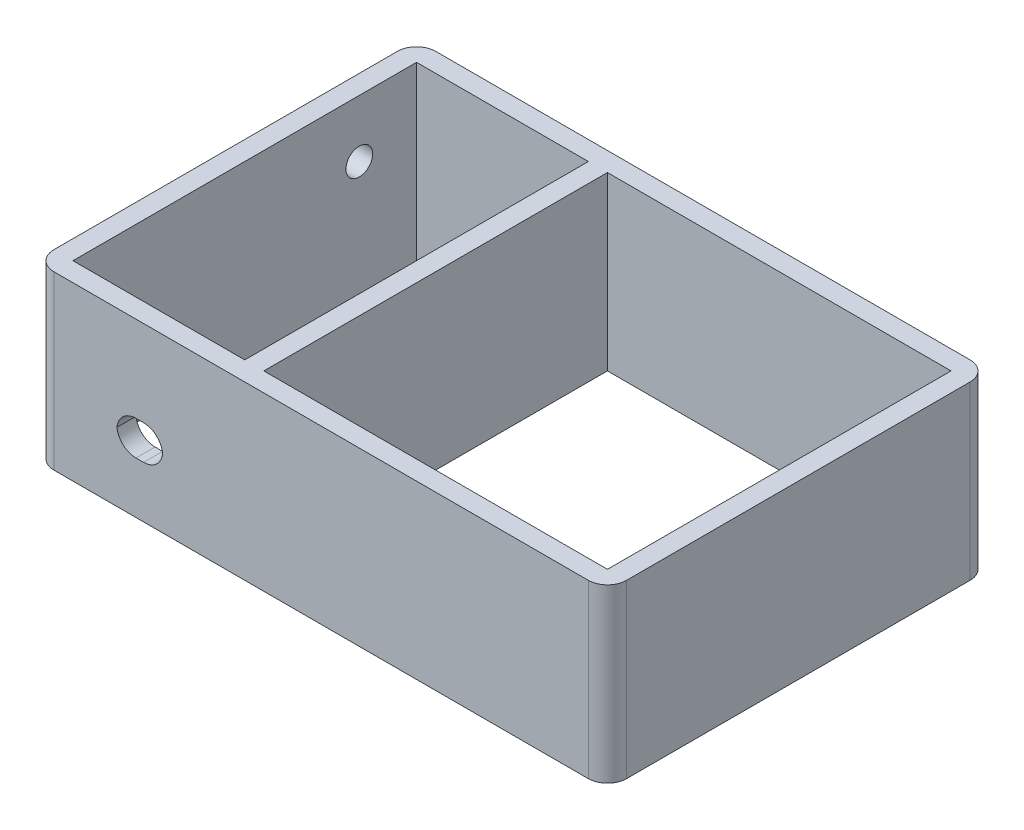
ISO-10303-21;
HEADER;
FILE_DESCRIPTION(('STEP AP214'),'2;1');
FILE_NAME('part.step','',(''),(''),'','','');
FILE_SCHEMA(('AUTOMOTIVE_DESIGN { 1 0 10303 214 1 1 1 1 }'));
ENDSEC;
DATA;
#1=APPLICATION_CONTEXT('core data for automotive mechanical design processes');
#2=APPLICATION_PROTOCOL_DEFINITION('international standard','automotive_design',2000,#1);
#3=PRODUCT_CONTEXT('',#1,'mechanical');
#4=PRODUCT('Part','Part','',(#3));
#5=PRODUCT_RELATED_PRODUCT_CATEGORY('part','',(#4));
#6=PRODUCT_DEFINITION_FORMATION('','',#4);
#7=PRODUCT_DEFINITION_CONTEXT('part definition',#1,'design');
#8=PRODUCT_DEFINITION('design','',#6,#7);
#9=PRODUCT_DEFINITION_SHAPE('','',#8);
#10=(LENGTH_UNIT() NAMED_UNIT(*) SI_UNIT(.MILLI.,.METRE.));
#11=(NAMED_UNIT(*) PLANE_ANGLE_UNIT() SI_UNIT($,.RADIAN.));
#12=(NAMED_UNIT(*) SI_UNIT($,.STERADIAN.) SOLID_ANGLE_UNIT());
#13=UNCERTAINTY_MEASURE_WITH_UNIT(LENGTH_MEASURE(1.E-05),#10,'distance_accuracy_value','');
#14=(GEOMETRIC_REPRESENTATION_CONTEXT(3) GLOBAL_UNCERTAINTY_ASSIGNED_CONTEXT((#13)) GLOBAL_UNIT_ASSIGNED_CONTEXT((#10,
#11,#12)) REPRESENTATION_CONTEXT('',''));
#15=CARTESIAN_POINT('',(0.,0.,0.));
#16=DIRECTION('',(0.,0.,1.));
#17=DIRECTION('',(1.,0.,0.));
#18=AXIS2_PLACEMENT_3D('',#15,#16,#17);
#19=CARTESIAN_POINT('',(-70.,45.,45.));
#20=DIRECTION('',(0.,0.,-1.));
#21=DIRECTION('',(-1.,0.,0.));
#22=AXIS2_PLACEMENT_3D('',#19,#20,#21);
#23=PLANE('',#22);
#24=DIRECTION('',(1.,0.,0.));
#25=VECTOR('',#24,1.);
#26=CARTESIAN_POINT('',(-70.,45.,45.));
#27=LINE('',#26,#25);
#28=CARTESIAN_POINT('',(-70.,45.,45.));
#29=VERTEX_POINT('',#28);
#30=CARTESIAN_POINT('',(-25.,45.,45.));
#31=VERTEX_POINT('',#30);
#32=EDGE_CURVE('E211',#29,#31,#27,.T.);
#33=ORIENTED_EDGE('',*,*,#32,.T.);
#34=DIRECTION('',(0.,-1.,0.));
#35=VECTOR('',#34,1.);
#36=CARTESIAN_POINT('',(-25.,45.,45.));
#37=LINE('',#36,#35);
#38=CARTESIAN_POINT('',(-25.,0.,45.));
#39=VERTEX_POINT('',#38);
#40=EDGE_CURVE('E355',#31,#39,#37,.T.);
#41=ORIENTED_EDGE('',*,*,#40,.T.);
#42=DIRECTION('',(1.,0.,0.));
#43=VECTOR('',#42,1.);
#44=CARTESIAN_POINT('',(-70.,0.,45.));
#45=LINE('',#44,#43);
#46=CARTESIAN_POINT('',(-70.,0.,45.));
#47=VERTEX_POINT('',#46);
#48=EDGE_CURVE('E227',#47,#39,#45,.T.);
#49=ORIENTED_EDGE('',*,*,#48,.F.);
#50=DIRECTION('',(0.,-1.,0.));
#51=VECTOR('',#50,1.);
#52=CARTESIAN_POINT('',(-70.,45.,45.));
#53=LINE('',#52,#51);
#54=EDGE_CURVE('E226',#29,#47,#53,.T.);
#55=ORIENTED_EDGE('',*,*,#54,.F.);
#56=EDGE_LOOP('',(#33,#41,#49,#55));
#57=FACE_BOUND('',#56,.T.);
#58=DIRECTION('',(1.,0.,0.));
#59=VECTOR('',#58,1.);
#60=CARTESIAN_POINT('',(-53.5,22.5,45.));
#61=LINE('',#60,#59);
#62=CARTESIAN_POINT('',(-48.5,22.5,45.));
#63=VERTEX_POINT('',#62);
#64=CARTESIAN_POINT('',(-46.5,22.5,45.));
#65=VERTEX_POINT('',#64);
#66=EDGE_CURVE('E346',#63,#65,#61,.T.);
#67=ORIENTED_EDGE('',*,*,#66,.F.);
#68=CARTESIAN_POINT('',(-48.5,17.5,45.));
#69=DIRECTION('',(0.,0.,-1.));
#70=DIRECTION('',(-1.,0.,0.));
#71=AXIS2_PLACEMENT_3D('',#68,#69,#70);
#72=CIRCLE('',#71,5.);
#73=CARTESIAN_POINT('',(-53.4749371855331,18.,45.));
#74=VERTEX_POINT('',#73);
#75=EDGE_CURVE('E321',#63,#74,#72,.F.);
#76=ORIENTED_EDGE('',*,*,#75,.T.);
#77=CARTESIAN_POINT('',(-48.5,18.5,45.));
#78=DIRECTION('',(0.,0.,-1.));
#79=DIRECTION('',(-1.,0.,0.));
#80=AXIS2_PLACEMENT_3D('',#77,#78,#79);
#81=CIRCLE('',#80,5.);
#82=CARTESIAN_POINT('',(-48.5,13.5,45.));
#83=VERTEX_POINT('',#82);
#84=EDGE_CURVE('E317',#74,#83,#81,.F.);
#85=ORIENTED_EDGE('',*,*,#84,.T.);
#86=DIRECTION('',(1.,0.,0.));
#87=VECTOR('',#86,1.);
#88=CARTESIAN_POINT('',(-53.5,13.5,45.));
#89=LINE('',#88,#87);
#90=CARTESIAN_POINT('',(-46.5,13.5,45.));
#91=VERTEX_POINT('',#90);
#92=EDGE_CURVE('E349',#83,#91,#89,.T.);
#93=ORIENTED_EDGE('',*,*,#92,.T.);
#94=CARTESIAN_POINT('',(-46.5,18.5,45.));
#95=DIRECTION('',(0.,0.,-1.));
#96=DIRECTION('',(-1.,0.,0.));
#97=AXIS2_PLACEMENT_3D('',#94,#95,#96);
#98=CIRCLE('',#97,5.);
#99=CARTESIAN_POINT('',(-41.5250628144669,18.,45.));
#100=VERTEX_POINT('',#99);
#101=EDGE_CURVE('E11',#91,#100,#98,.F.);
#102=ORIENTED_EDGE('',*,*,#101,.T.);
#103=CARTESIAN_POINT('',(-46.5,17.5,45.));
#104=DIRECTION('',(0.,0.,-1.));
#105=DIRECTION('',(-1.,0.,0.));
#106=AXIS2_PLACEMENT_3D('',#103,#104,#105);
#107=CIRCLE('',#106,5.);
#108=EDGE_CURVE('E324',#100,#65,#107,.F.);
#109=ORIENTED_EDGE('',*,*,#108,.T.);
#110=EDGE_LOOP('',(#67,#76,#85,#93,#102,#109));
#111=FACE_BOUND('',#110,.T.);
#112=ADVANCED_FACE('F36',(#57,#111),#23,.T.);
#113=CARTESIAN_POINT('',(-75.,45.,50.));
#114=DIRECTION('',(0.,0.,-1.));
#115=DIRECTION('',(-1.,0.,0.));
#116=AXIS2_PLACEMENT_3D('',#113,#114,#115);
#117=PLANE('',#116);
#118=DIRECTION('',(1.,0.,0.));
#119=VECTOR('',#118,1.);
#120=CARTESIAN_POINT('',(-75.,45.,50.));
#121=LINE('',#120,#119);
#122=CARTESIAN_POINT('',(-70.,45.,50.));
#123=VERTEX_POINT('',#122);
#124=CARTESIAN_POINT('',(70.,45.,50.));
#125=VERTEX_POINT('',#124);
#126=EDGE_CURVE('E256',#123,#125,#121,.T.);
#127=ORIENTED_EDGE('',*,*,#126,.F.);
#128=DIRECTION('',(0.,-1.,0.));
#129=VECTOR('',#128,1.);
#130=CARTESIAN_POINT('',(-70.,45.,50.));
#131=LINE('',#130,#129);
#132=CARTESIAN_POINT('',(-70.,0.,50.));
#133=VERTEX_POINT('',#132);
#134=EDGE_CURVE('E302',#123,#133,#131,.T.);
#135=ORIENTED_EDGE('',*,*,#134,.T.);
#136=DIRECTION('',(1.,0.,0.));
#137=VECTOR('',#136,1.);
#138=CARTESIAN_POINT('',(-75.,0.,50.));
#139=LINE('',#138,#137);
#140=CARTESIAN_POINT('',(70.,0.,50.));
#141=VERTEX_POINT('',#140);
#142=EDGE_CURVE('E250',#133,#141,#139,.T.);
#143=ORIENTED_EDGE('',*,*,#142,.T.);
#144=DIRECTION('',(0.,-1.,0.));
#145=VECTOR('',#144,1.);
#146=CARTESIAN_POINT('',(70.,45.,50.));
#147=LINE('',#146,#145);
#148=EDGE_CURVE('E300',#141,#125,#147,.F.);
#149=ORIENTED_EDGE('',*,*,#148,.T.);
#150=EDGE_LOOP('',(#127,#135,#143,#149));
#151=FACE_BOUND('',#150,.T.);
#152=CARTESIAN_POINT('',(-48.5,18.5,50.));
#153=DIRECTION('',(0.,0.,-1.));
#154=DIRECTION('',(-1.,0.,0.));
#155=AXIS2_PLACEMENT_3D('',#152,#153,#154);
#156=CIRCLE('',#155,5.);
#157=CARTESIAN_POINT('',(-48.5,13.5,50.));
#158=VERTEX_POINT('',#157);
#159=CARTESIAN_POINT('',(-53.4749371855331,18.,50.));
#160=VERTEX_POINT('',#159);
#161=EDGE_CURVE('E315',#158,#160,#156,.T.);
#162=ORIENTED_EDGE('',*,*,#161,.T.);
#163=CARTESIAN_POINT('',(-48.5,17.5,50.));
#164=DIRECTION('',(0.,0.,-1.));
#165=DIRECTION('',(-1.,0.,0.));
#166=AXIS2_PLACEMENT_3D('',#163,#164,#165);
#167=CIRCLE('',#166,5.);
#168=CARTESIAN_POINT('',(-48.5,22.5,50.));
#169=VERTEX_POINT('',#168);
#170=EDGE_CURVE('E319',#160,#169,#167,.T.);
#171=ORIENTED_EDGE('',*,*,#170,.T.);
#172=DIRECTION('',(1.,0.,0.));
#173=VECTOR('',#172,1.);
#174=CARTESIAN_POINT('',(-53.5,22.5,50.));
#175=LINE('',#174,#173);
#176=CARTESIAN_POINT('',(-46.5,22.5,50.));
#177=VERTEX_POINT('',#176);
#178=EDGE_CURVE('E328',#169,#177,#175,.T.);
#179=ORIENTED_EDGE('',*,*,#178,.T.);
#180=CARTESIAN_POINT('',(-46.5,17.5,50.));
#181=DIRECTION('',(0.,0.,-1.));
#182=DIRECTION('',(-1.,0.,0.));
#183=AXIS2_PLACEMENT_3D('',#180,#181,#182);
#184=CIRCLE('',#183,5.);
#185=CARTESIAN_POINT('',(-41.5250628144669,18.,50.));
#186=VERTEX_POINT('',#185);
#187=EDGE_CURVE('E59',#177,#186,#184,.T.);
#188=ORIENTED_EDGE('',*,*,#187,.T.);
#189=CARTESIAN_POINT('',(-46.5,18.5,50.));
#190=DIRECTION('',(0.,0.,-1.));
#191=DIRECTION('',(-1.,0.,0.));
#192=AXIS2_PLACEMENT_3D('',#189,#190,#191);
#193=CIRCLE('',#192,5.);
#194=CARTESIAN_POINT('',(-46.5,13.5,50.));
#195=VERTEX_POINT('',#194);
#196=EDGE_CURVE('E45',#186,#195,#193,.T.);
#197=ORIENTED_EDGE('',*,*,#196,.T.);
#198=DIRECTION('',(1.,0.,0.));
#199=VECTOR('',#198,1.);
#200=CARTESIAN_POINT('',(-53.5,13.5,50.));
#201=LINE('',#200,#199);
#202=EDGE_CURVE('E332',#158,#195,#201,.T.);
#203=ORIENTED_EDGE('',*,*,#202,.F.);
#204=EDGE_LOOP('',(#162,#171,#179,#188,#197,#203));
#205=FACE_BOUND('',#204,.T.);
#206=ADVANCED_FACE('F388',(#151,#205),#117,.F.);
#207=CARTESIAN_POINT('',(-20.,0.,45.));
#208=VERTEX_POINT('',#207);
#209=CARTESIAN_POINT('',(70.,0.,45.));
#210=VERTEX_POINT('',#209);
#211=EDGE_CURVE('E205',#208,#210,#45,.T.);
#212=ORIENTED_EDGE('',*,*,#211,.F.);
#213=DIRECTION('',(0.,-1.,0.));
#214=VECTOR('',#213,1.);
#215=CARTESIAN_POINT('',(-20.,45.,45.));
#216=LINE('',#215,#214);
#217=CARTESIAN_POINT('',(-20.,45.,45.));
#218=VERTEX_POINT('',#217);
#219=EDGE_CURVE('E188',#218,#208,#216,.T.);
#220=ORIENTED_EDGE('',*,*,#219,.F.);
#221=CARTESIAN_POINT('',(70.,45.,45.));
#222=VERTEX_POINT('',#221);
#223=EDGE_CURVE('E203',#218,#222,#27,.T.);
#224=ORIENTED_EDGE('',*,*,#223,.T.);
#225=DIRECTION('',(0.,-1.,0.));
#226=VECTOR('',#225,1.);
#227=CARTESIAN_POINT('',(70.,45.,45.));
#228=LINE('',#227,#226);
#229=EDGE_CURVE('E243',#222,#210,#228,.T.);
#230=ORIENTED_EDGE('',*,*,#229,.T.);
#231=EDGE_LOOP('',(#212,#220,#224,#230));
#232=FACE_BOUND('',#231,.T.);
#233=ADVANCED_FACE('F201',(#232),#23,.T.);
#234=CARTESIAN_POINT('',(-70.,45.,-45.));
#235=DIRECTION('',(0.,0.,1.));
#236=DIRECTION('',(1.,0.,0.));
#237=AXIS2_PLACEMENT_3D('',#234,#235,#236);
#238=PLANE('',#237);
#239=DIRECTION('',(-1.,0.,0.));
#240=VECTOR('',#239,1.);
#241=CARTESIAN_POINT('',(-70.,45.,-45.));
#242=LINE('',#241,#240);
#243=CARTESIAN_POINT('',(70.,45.,-45.));
#244=VERTEX_POINT('',#243);
#245=CARTESIAN_POINT('',(-20.,45.,-45.));
#246=VERTEX_POINT('',#245);
#247=EDGE_CURVE('E222',#244,#246,#242,.T.);
#248=ORIENTED_EDGE('',*,*,#247,.T.);
#249=DIRECTION('',(0.,-1.,0.));
#250=VECTOR('',#249,1.);
#251=CARTESIAN_POINT('',(-20.,45.,-45.));
#252=LINE('',#251,#250);
#253=CARTESIAN_POINT('',(-20.,0.,-45.));
#254=VERTEX_POINT('',#253);
#255=EDGE_CURVE('E191',#246,#254,#252,.T.);
#256=ORIENTED_EDGE('',*,*,#255,.T.);
#257=DIRECTION('',(-1.,0.,0.));
#258=VECTOR('',#257,1.);
#259=CARTESIAN_POINT('',(-70.,0.,-45.));
#260=LINE('',#259,#258);
#261=CARTESIAN_POINT('',(70.,0.,-45.));
#262=VERTEX_POINT('',#261);
#263=EDGE_CURVE('E216',#262,#254,#260,.T.);
#264=ORIENTED_EDGE('',*,*,#263,.F.);
#265=DIRECTION('',(0.,-1.,0.));
#266=VECTOR('',#265,1.);
#267=CARTESIAN_POINT('',(70.,45.,-45.));
#268=LINE('',#267,#266);
#269=EDGE_CURVE('E241',#244,#262,#268,.T.);
#270=ORIENTED_EDGE('',*,*,#269,.F.);
#271=EDGE_LOOP('',(#248,#256,#264,#270));
#272=FACE_BOUND('',#271,.T.);
#273=ADVANCED_FACE('F364',(#272),#238,.T.);
#274=CARTESIAN_POINT('',(-25.,0.,-45.));
#275=VERTEX_POINT('',#274);
#276=CARTESIAN_POINT('',(-70.,0.,-45.));
#277=VERTEX_POINT('',#276);
#278=EDGE_CURVE('E233',#275,#277,#260,.T.);
#279=ORIENTED_EDGE('',*,*,#278,.F.);
#280=DIRECTION('',(0.,-1.,0.));
#281=VECTOR('',#280,1.);
#282=CARTESIAN_POINT('',(-25.,45.,-45.));
#283=LINE('',#282,#281);
#284=CARTESIAN_POINT('',(-25.,45.,-45.));
#285=VERTEX_POINT('',#284);
#286=EDGE_CURVE('E360',#285,#275,#283,.T.);
#287=ORIENTED_EDGE('',*,*,#286,.F.);
#288=CARTESIAN_POINT('',(-70.,45.,-45.));
#289=VERTEX_POINT('',#288);
#290=EDGE_CURVE('E221',#285,#289,#242,.T.);
#291=ORIENTED_EDGE('',*,*,#290,.T.);
#292=DIRECTION('',(0.,-1.,0.));
#293=VECTOR('',#292,1.);
#294=CARTESIAN_POINT('',(-70.,45.,-45.));
#295=LINE('',#294,#293);
#296=EDGE_CURVE('E238',#289,#277,#295,.T.);
#297=ORIENTED_EDGE('',*,*,#296,.T.);
#298=EDGE_LOOP('',(#279,#287,#291,#297));
#299=FACE_BOUND('',#298,.T.);
#300=ADVANCED_FACE('F400',(#299),#238,.T.);
#301=CARTESIAN_POINT('',(0.,45.,0.));
#302=DIRECTION('',(0.,-1.,0.));
#303=DIRECTION('',(0.,0.,-1.));
#304=AXIS2_PLACEMENT_3D('',#301,#302,#303);
#305=PLANE('',#304);
#306=ORIENTED_EDGE('',*,*,#223,.F.);
#307=DIRECTION('',(0.,0.,-1.));
#308=VECTOR('',#307,1.);
#309=CARTESIAN_POINT('',(-20.,45.,-45.));
#310=LINE('',#309,#308);
#311=EDGE_CURVE('E185',#218,#246,#310,.T.);
#312=ORIENTED_EDGE('',*,*,#311,.T.);
#313=ORIENTED_EDGE('',*,*,#247,.F.);
#314=DIRECTION('',(0.,0.,-1.));
#315=VECTOR('',#314,1.);
#316=CARTESIAN_POINT('',(70.,45.,45.));
#317=LINE('',#316,#315);
#318=EDGE_CURVE('E210',#222,#244,#317,.T.);
#319=ORIENTED_EDGE('',*,*,#318,.F.);
#320=EDGE_LOOP('',(#306,#312,#313,#319));
#321=FACE_BOUND('',#320,.T.);
#322=DIRECTION('',(0.,0.,-1.));
#323=VECTOR('',#322,1.);
#324=CARTESIAN_POINT('',(75.,45.,50.));
#325=LINE('',#324,#323);
#326=CARTESIAN_POINT('',(75.,45.,45.));
#327=VERTEX_POINT('',#326);
#328=CARTESIAN_POINT('',(75.,45.,-45.));
#329=VERTEX_POINT('',#328);
#330=EDGE_CURVE('E246',#327,#329,#325,.T.);
#331=ORIENTED_EDGE('',*,*,#330,.T.);
#332=CARTESIAN_POINT('',(70.,45.,-45.));
#333=DIRECTION('',(0.,-1.,0.));
#334=DIRECTION('',(0.,0.,-1.));
#335=AXIS2_PLACEMENT_3D('',#332,#333,#334);
#336=CIRCLE('',#335,5.);
#337=CARTESIAN_POINT('',(70.,45.,-50.));
#338=VERTEX_POINT('',#337);
#339=EDGE_CURVE('E293',#329,#338,#336,.F.);
#340=ORIENTED_EDGE('',*,*,#339,.T.);
#341=DIRECTION('',(-1.,0.,0.));
#342=VECTOR('',#341,1.);
#343=CARTESIAN_POINT('',(-75.,45.,-50.));
#344=LINE('',#343,#342);
#345=CARTESIAN_POINT('',(-70.,45.,-50.));
#346=VERTEX_POINT('',#345);
#347=EDGE_CURVE('E249',#338,#346,#344,.T.);
#348=ORIENTED_EDGE('',*,*,#347,.T.);
#349=CARTESIAN_POINT('',(-70.,45.,-45.));
#350=DIRECTION('',(0.,-1.,0.));
#351=DIRECTION('',(0.,0.,-1.));
#352=AXIS2_PLACEMENT_3D('',#349,#350,#351);
#353=CIRCLE('',#352,5.);
#354=CARTESIAN_POINT('',(-75.,45.,-45.));
#355=VERTEX_POINT('',#354);
#356=EDGE_CURVE('E291',#346,#355,#353,.F.);
#357=ORIENTED_EDGE('',*,*,#356,.T.);
#358=DIRECTION('',(0.,0.,1.));
#359=VECTOR('',#358,1.);
#360=CARTESIAN_POINT('',(-75.,45.,50.));
#361=LINE('',#360,#359);
#362=CARTESIAN_POINT('',(-75.,45.,45.));
#363=VERTEX_POINT('',#362);
#364=EDGE_CURVE('E253',#355,#363,#361,.T.);
#365=ORIENTED_EDGE('',*,*,#364,.T.);
#366=CARTESIAN_POINT('',(-70.,45.,45.));
#367=DIRECTION('',(0.,-1.,0.));
#368=DIRECTION('',(0.,0.,-1.));
#369=AXIS2_PLACEMENT_3D('',#366,#367,#368);
#370=CIRCLE('',#369,5.);
#371=EDGE_CURVE('E289',#363,#123,#370,.F.);
#372=ORIENTED_EDGE('',*,*,#371,.T.);
#373=ORIENTED_EDGE('',*,*,#126,.T.);
#374=CARTESIAN_POINT('',(70.,45.,45.));
#375=DIRECTION('',(0.,-1.,0.));
#376=DIRECTION('',(0.,0.,-1.));
#377=AXIS2_PLACEMENT_3D('',#374,#375,#376);
#378=CIRCLE('',#377,5.);
#379=EDGE_CURVE('E287',#125,#327,#378,.F.);
#380=ORIENTED_EDGE('',*,*,#379,.T.);
#381=EDGE_LOOP('',(#331,#340,#348,#357,#365,#372,#373,#380));
#382=FACE_BOUND('',#381,.T.);
#383=ORIENTED_EDGE('',*,*,#32,.F.);
#384=DIRECTION('',(0.,0.,1.));
#385=VECTOR('',#384,1.);
#386=CARTESIAN_POINT('',(-70.,45.,45.));
#387=LINE('',#386,#385);
#388=EDGE_CURVE('E224',#289,#29,#387,.T.);
#389=ORIENTED_EDGE('',*,*,#388,.F.);
#390=ORIENTED_EDGE('',*,*,#290,.F.);
#391=DIRECTION('',(0.,0.,1.));
#392=VECTOR('',#391,1.);
#393=CARTESIAN_POINT('',(-25.,45.,-45.));
#394=LINE('',#393,#392);
#395=EDGE_CURVE('E196',#285,#31,#394,.T.);
#396=ORIENTED_EDGE('',*,*,#395,.T.);
#397=EDGE_LOOP('',(#383,#389,#390,#396));
#398=FACE_BOUND('',#397,.T.);
#399=ADVANCED_FACE('F208',(#321,#382,#398),#305,.F.);
#400=CARTESIAN_POINT('',(0.,0.,0.));
#401=DIRECTION('',(0.,-1.,0.));
#402=DIRECTION('',(0.,0.,-1.));
#403=AXIS2_PLACEMENT_3D('',#400,#401,#402);
#404=PLANE('',#403);
#405=DIRECTION('',(0.,0.,-1.));
#406=VECTOR('',#405,1.);
#407=CARTESIAN_POINT('',(-20.,0.,-45.));
#408=LINE('',#407,#406);
#409=EDGE_CURVE('E350',#208,#254,#408,.T.);
#410=ORIENTED_EDGE('',*,*,#409,.F.);
#411=ORIENTED_EDGE('',*,*,#211,.T.);
#412=DIRECTION('',(0.,0.,-1.));
#413=VECTOR('',#412,1.);
#414=CARTESIAN_POINT('',(70.,0.,45.));
#415=LINE('',#414,#413);
#416=EDGE_CURVE('E230',#210,#262,#415,.T.);
#417=ORIENTED_EDGE('',*,*,#416,.T.);
#418=ORIENTED_EDGE('',*,*,#263,.T.);
#419=EDGE_LOOP('',(#410,#411,#417,#418));
#420=FACE_BOUND('',#419,.T.);
#421=DIRECTION('',(-1.,0.,0.));
#422=VECTOR('',#421,1.);
#423=CARTESIAN_POINT('',(-75.,0.,-50.));
#424=LINE('',#423,#422);
#425=CARTESIAN_POINT('',(70.,0.,-50.));
#426=VERTEX_POINT('',#425);
#427=CARTESIAN_POINT('',(-70.,0.,-50.));
#428=VERTEX_POINT('',#427);
#429=EDGE_CURVE('E262',#426,#428,#424,.T.);
#430=ORIENTED_EDGE('',*,*,#429,.F.);
#431=CARTESIAN_POINT('',(70.,0.,-45.));
#432=DIRECTION('',(0.,-1.,0.));
#433=DIRECTION('',(0.,0.,-1.));
#434=AXIS2_PLACEMENT_3D('',#431,#432,#433);
#435=CIRCLE('',#434,5.);
#436=CARTESIAN_POINT('',(75.,0.,-45.));
#437=VERTEX_POINT('',#436);
#438=EDGE_CURVE('E280',#426,#437,#435,.T.);
#439=ORIENTED_EDGE('',*,*,#438,.T.);
#440=DIRECTION('',(0.,0.,-1.));
#441=VECTOR('',#440,1.);
#442=CARTESIAN_POINT('',(75.,0.,50.));
#443=LINE('',#442,#441);
#444=CARTESIAN_POINT('',(75.,0.,45.));
#445=VERTEX_POINT('',#444);
#446=EDGE_CURVE('E245',#445,#437,#443,.T.);
#447=ORIENTED_EDGE('',*,*,#446,.F.);
#448=CARTESIAN_POINT('',(70.,0.,45.));
#449=DIRECTION('',(0.,-1.,0.));
#450=DIRECTION('',(0.,0.,-1.));
#451=AXIS2_PLACEMENT_3D('',#448,#449,#450);
#452=CIRCLE('',#451,5.);
#453=EDGE_CURVE('E274',#445,#141,#452,.T.);
#454=ORIENTED_EDGE('',*,*,#453,.T.);
#455=ORIENTED_EDGE('',*,*,#142,.F.);
#456=CARTESIAN_POINT('',(-70.,0.,45.));
#457=DIRECTION('',(0.,-1.,0.));
#458=DIRECTION('',(0.,0.,-1.));
#459=AXIS2_PLACEMENT_3D('',#456,#457,#458);
#460=CIRCLE('',#459,5.);
#461=CARTESIAN_POINT('',(-75.,0.,45.));
#462=VERTEX_POINT('',#461);
#463=EDGE_CURVE('E276',#133,#462,#460,.T.);
#464=ORIENTED_EDGE('',*,*,#463,.T.);
#465=DIRECTION('',(0.,0.,1.));
#466=VECTOR('',#465,1.);
#467=CARTESIAN_POINT('',(-75.,0.,50.));
#468=LINE('',#467,#466);
#469=CARTESIAN_POINT('',(-75.,0.,-45.));
#470=VERTEX_POINT('',#469);
#471=EDGE_CURVE('E265',#470,#462,#468,.T.);
#472=ORIENTED_EDGE('',*,*,#471,.F.);
#473=CARTESIAN_POINT('',(-70.,0.,-45.));
#474=DIRECTION('',(0.,-1.,0.));
#475=DIRECTION('',(0.,0.,-1.));
#476=AXIS2_PLACEMENT_3D('',#473,#474,#475);
#477=CIRCLE('',#476,5.);
#478=EDGE_CURVE('E278',#470,#428,#477,.T.);
#479=ORIENTED_EDGE('',*,*,#478,.T.);
#480=EDGE_LOOP('',(#430,#439,#447,#454,#455,#464,#472,#479));
#481=FACE_BOUND('',#480,.T.);
#482=DIRECTION('',(0.,0.,1.));
#483=VECTOR('',#482,1.);
#484=CARTESIAN_POINT('',(-70.,0.,45.));
#485=LINE('',#484,#483);
#486=EDGE_CURVE('E212',#277,#47,#485,.T.);
#487=ORIENTED_EDGE('',*,*,#486,.T.);
#488=ORIENTED_EDGE('',*,*,#48,.T.);
#489=DIRECTION('',(0.,0.,1.));
#490=VECTOR('',#489,1.);
#491=CARTESIAN_POINT('',(-25.,0.,-45.));
#492=LINE('',#491,#490);
#493=EDGE_CURVE('E197',#275,#39,#492,.T.);
#494=ORIENTED_EDGE('',*,*,#493,.F.);
#495=ORIENTED_EDGE('',*,*,#278,.T.);
#496=EDGE_LOOP('',(#487,#488,#494,#495));
#497=FACE_BOUND('',#496,.T.);
#498=ADVANCED_FACE('F367',(#420,#481,#497),#404,.T.);
#499=CARTESIAN_POINT('',(75.,45.,50.));
#500=DIRECTION('',(-1.,0.,0.));
#501=DIRECTION('',(0.,0.,1.));
#502=AXIS2_PLACEMENT_3D('',#499,#500,#501);
#503=PLANE('',#502);
#504=ORIENTED_EDGE('',*,*,#446,.T.);
#505=DIRECTION('',(0.,-1.,0.));
#506=VECTOR('',#505,1.);
#507=CARTESIAN_POINT('',(75.,45.,-45.));
#508=LINE('',#507,#506);
#509=EDGE_CURVE('E285',#437,#329,#508,.F.);
#510=ORIENTED_EDGE('',*,*,#509,.T.);
#511=ORIENTED_EDGE('',*,*,#330,.F.);
#512=DIRECTION('',(0.,-1.,0.));
#513=VECTOR('',#512,1.);
#514=CARTESIAN_POINT('',(75.,45.,45.));
#515=LINE('',#514,#513);
#516=EDGE_CURVE('E282',#327,#445,#515,.T.);
#517=ORIENTED_EDGE('',*,*,#516,.T.);
#518=EDGE_LOOP('',(#504,#510,#511,#517));
#519=FACE_BOUND('',#518,.T.);
#520=ADVANCED_FACE('F451',(#519),#503,.F.);
#521=CARTESIAN_POINT('',(-75.,45.,-50.));
#522=DIRECTION('',(0.,0.,1.));
#523=DIRECTION('',(1.,0.,0.));
#524=AXIS2_PLACEMENT_3D('',#521,#522,#523);
#525=PLANE('',#524);
#526=ORIENTED_EDGE('',*,*,#347,.F.);
#527=DIRECTION('',(0.,-1.,0.));
#528=VECTOR('',#527,1.);
#529=CARTESIAN_POINT('',(70.,45.,-50.));
#530=LINE('',#529,#528);
#531=EDGE_CURVE('E271',#338,#426,#530,.T.);
#532=ORIENTED_EDGE('',*,*,#531,.T.);
#533=ORIENTED_EDGE('',*,*,#429,.T.);
#534=DIRECTION('',(0.,-1.,0.));
#535=VECTOR('',#534,1.);
#536=CARTESIAN_POINT('',(-70.,45.,-50.));
#537=LINE('',#536,#535);
#538=EDGE_CURVE('E259',#428,#346,#537,.F.);
#539=ORIENTED_EDGE('',*,*,#538,.T.);
#540=EDGE_LOOP('',(#526,#532,#533,#539));
#541=FACE_BOUND('',#540,.T.);
#542=ADVANCED_FACE('F382',(#541),#525,.F.);
#543=CARTESIAN_POINT('',(-75.,45.,50.));
#544=DIRECTION('',(1.,0.,0.));
#545=DIRECTION('',(0.,0.,-1.));
#546=AXIS2_PLACEMENT_3D('',#543,#544,#545);
#547=PLANE('',#546);
#548=CARTESIAN_POINT('',(-75.,30.,-30.));
#549=DIRECTION('',(-1.,0.,0.));
#550=DIRECTION('',(0.,0.,1.));
#551=AXIS2_PLACEMENT_3D('',#548,#549,#550);
#552=CIRCLE('',#551,3.5);
#553=CARTESIAN_POINT('',(-75.,30.,-26.5));
#554=VERTEX_POINT('',#553);
#555=EDGE_CURVE('E339',#554,#554,#552,.T.);
#556=ORIENTED_EDGE('',*,*,#555,.F.);
#557=EDGE_LOOP('',(#556));
#558=FACE_BOUND('',#557,.T.);
#559=ORIENTED_EDGE('',*,*,#364,.F.);
#560=DIRECTION('',(0.,-1.,0.));
#561=VECTOR('',#560,1.);
#562=CARTESIAN_POINT('',(-75.,45.,-45.));
#563=LINE('',#562,#561);
#564=EDGE_CURVE('E297',#355,#470,#563,.T.);
#565=ORIENTED_EDGE('',*,*,#564,.T.);
#566=ORIENTED_EDGE('',*,*,#471,.T.);
#567=DIRECTION('',(0.,-1.,0.));
#568=VECTOR('',#567,1.);
#569=CARTESIAN_POINT('',(-75.,45.,45.));
#570=LINE('',#569,#568);
#571=EDGE_CURVE('E295',#462,#363,#570,.F.);
#572=ORIENTED_EDGE('',*,*,#571,.T.);
#573=EDGE_LOOP('',(#559,#565,#566,#572));
#574=FACE_BOUND('',#573,.T.);
#575=ADVANCED_FACE('F374',(#558,#574),#547,.F.);
#576=CARTESIAN_POINT('',(70.,45.,45.));
#577=DIRECTION('',(-1.,0.,0.));
#578=DIRECTION('',(0.,0.,1.));
#579=AXIS2_PLACEMENT_3D('',#576,#577,#578);
#580=PLANE('',#579);
#581=ORIENTED_EDGE('',*,*,#416,.F.);
#582=ORIENTED_EDGE('',*,*,#229,.F.);
#583=ORIENTED_EDGE('',*,*,#318,.T.);
#584=ORIENTED_EDGE('',*,*,#269,.T.);
#585=EDGE_LOOP('',(#581,#582,#583,#584));
#586=FACE_BOUND('',#585,.T.);
#587=ADVANCED_FACE('F371',(#586),#580,.T.);
#588=CARTESIAN_POINT('',(-70.,45.,45.));
#589=DIRECTION('',(1.,0.,0.));
#590=DIRECTION('',(0.,0.,-1.));
#591=AXIS2_PLACEMENT_3D('',#588,#589,#590);
#592=PLANE('',#591);
#593=CARTESIAN_POINT('',(-70.,30.,-30.));
#594=DIRECTION('',(-1.,0.,0.));
#595=DIRECTION('',(0.,0.,1.));
#596=AXIS2_PLACEMENT_3D('',#593,#594,#595);
#597=CIRCLE('',#596,3.5);
#598=CARTESIAN_POINT('',(-70.,30.,-26.5));
#599=VERTEX_POINT('',#598);
#600=EDGE_CURVE('E335',#599,#599,#597,.T.);
#601=ORIENTED_EDGE('',*,*,#600,.T.);
#602=EDGE_LOOP('',(#601));
#603=FACE_BOUND('',#602,.T.);
#604=ORIENTED_EDGE('',*,*,#486,.F.);
#605=ORIENTED_EDGE('',*,*,#296,.F.);
#606=ORIENTED_EDGE('',*,*,#388,.T.);
#607=ORIENTED_EDGE('',*,*,#54,.T.);
#608=EDGE_LOOP('',(#604,#605,#606,#607));
#609=FACE_BOUND('',#608,.T.);
#610=ADVANCED_FACE('F373',(#603,#609),#592,.T.);
#611=CARTESIAN_POINT('',(70.,45.,-45.));
#612=DIRECTION('',(0.,-1.,0.));
#613=DIRECTION('',(0.,0.,-1.));
#614=AXIS2_PLACEMENT_3D('',#611,#612,#613);
#615=CYLINDRICAL_SURFACE('',#614,5.);
#616=ORIENTED_EDGE('',*,*,#339,.F.);
#617=ORIENTED_EDGE('',*,*,#509,.F.);
#618=ORIENTED_EDGE('',*,*,#438,.F.);
#619=ORIENTED_EDGE('',*,*,#531,.F.);
#620=EDGE_LOOP('',(#616,#617,#618,#619));
#621=FACE_BOUND('',#620,.T.);
#622=ADVANCED_FACE('F380',(#621),#615,.T.);
#623=CARTESIAN_POINT('',(-70.,45.,-45.));
#624=DIRECTION('',(0.,-1.,0.));
#625=DIRECTION('',(0.,0.,-1.));
#626=AXIS2_PLACEMENT_3D('',#623,#624,#625);
#627=CYLINDRICAL_SURFACE('',#626,5.);
#628=ORIENTED_EDGE('',*,*,#356,.F.);
#629=ORIENTED_EDGE('',*,*,#538,.F.);
#630=ORIENTED_EDGE('',*,*,#478,.F.);
#631=ORIENTED_EDGE('',*,*,#564,.F.);
#632=EDGE_LOOP('',(#628,#629,#630,#631));
#633=FACE_BOUND('',#632,.T.);
#634=ADVANCED_FACE('F439',(#633),#627,.T.);
#635=CARTESIAN_POINT('',(-70.,45.,45.));
#636=DIRECTION('',(0.,-1.,0.));
#637=DIRECTION('',(0.,0.,-1.));
#638=AXIS2_PLACEMENT_3D('',#635,#636,#637);
#639=CYLINDRICAL_SURFACE('',#638,5.);
#640=ORIENTED_EDGE('',*,*,#371,.F.);
#641=ORIENTED_EDGE('',*,*,#571,.F.);
#642=ORIENTED_EDGE('',*,*,#463,.F.);
#643=ORIENTED_EDGE('',*,*,#134,.F.);
#644=EDGE_LOOP('',(#640,#641,#642,#643));
#645=FACE_BOUND('',#644,.T.);
#646=ADVANCED_FACE('F461',(#645),#639,.T.);
#647=CARTESIAN_POINT('',(70.,45.,45.));
#648=DIRECTION('',(0.,-1.,0.));
#649=DIRECTION('',(0.,0.,-1.));
#650=AXIS2_PLACEMENT_3D('',#647,#648,#649);
#651=CYLINDRICAL_SURFACE('',#650,5.);
#652=ORIENTED_EDGE('',*,*,#379,.F.);
#653=ORIENTED_EDGE('',*,*,#148,.F.);
#654=ORIENTED_EDGE('',*,*,#453,.F.);
#655=ORIENTED_EDGE('',*,*,#516,.F.);
#656=EDGE_LOOP('',(#652,#653,#654,#655));
#657=FACE_BOUND('',#656,.T.);
#658=ADVANCED_FACE('F409',(#657),#651,.T.);
#659=CARTESIAN_POINT('',(-20.,45.,-45.));
#660=DIRECTION('',(-1.,0.,0.));
#661=DIRECTION('',(0.,0.,1.));
#662=AXIS2_PLACEMENT_3D('',#659,#660,#661);
#663=PLANE('',#662);
#664=ORIENTED_EDGE('',*,*,#409,.T.);
#665=ORIENTED_EDGE('',*,*,#255,.F.);
#666=ORIENTED_EDGE('',*,*,#311,.F.);
#667=ORIENTED_EDGE('',*,*,#219,.T.);
#668=EDGE_LOOP('',(#664,#665,#666,#667));
#669=FACE_BOUND('',#668,.T.);
#670=ADVANCED_FACE('F187',(#669),#663,.F.);
#671=CARTESIAN_POINT('',(-25.,45.,-45.));
#672=DIRECTION('',(1.,0.,0.));
#673=DIRECTION('',(0.,0.,-1.));
#674=AXIS2_PLACEMENT_3D('',#671,#672,#673);
#675=PLANE('',#674);
#676=ORIENTED_EDGE('',*,*,#493,.T.);
#677=ORIENTED_EDGE('',*,*,#40,.F.);
#678=ORIENTED_EDGE('',*,*,#395,.F.);
#679=ORIENTED_EDGE('',*,*,#286,.T.);
#680=EDGE_LOOP('',(#676,#677,#678,#679));
#681=FACE_BOUND('',#680,.T.);
#682=ADVANCED_FACE('F408',(#681),#675,.F.);
#683=CARTESIAN_POINT('',(-53.5,22.5,45.));
#684=DIRECTION('',(0.,-1.,0.));
#685=DIRECTION('',(0.,0.,-1.));
#686=AXIS2_PLACEMENT_3D('',#683,#684,#685);
#687=PLANE('',#686);
#688=ORIENTED_EDGE('',*,*,#178,.F.);
#689=DIRECTION('',(0.,0.,1.));
#690=VECTOR('',#689,1.);
#691=CARTESIAN_POINT('',(-48.5,22.5,45.));
#692=LINE('',#691,#690);
#693=EDGE_CURVE('E313',#169,#63,#692,.F.);
#694=ORIENTED_EDGE('',*,*,#693,.T.);
#695=ORIENTED_EDGE('',*,*,#66,.T.);
#696=DIRECTION('',(0.,0.,1.));
#697=VECTOR('',#696,1.);
#698=CARTESIAN_POINT('',(-46.5,22.5,45.));
#699=LINE('',#698,#697);
#700=EDGE_CURVE('E310',#65,#177,#699,.T.);
#701=ORIENTED_EDGE('',*,*,#700,.T.);
#702=EDGE_LOOP('',(#688,#694,#695,#701));
#703=FACE_BOUND('',#702,.T.);
#704=ADVANCED_FACE('F412',(#703),#687,.T.);
#705=CARTESIAN_POINT('',(-53.5,13.5,45.));
#706=DIRECTION('',(0.,-1.,0.));
#707=DIRECTION('',(0.,0.,-1.));
#708=AXIS2_PLACEMENT_3D('',#705,#706,#707);
#709=PLANE('',#708);
#710=ORIENTED_EDGE('',*,*,#92,.F.);
#711=DIRECTION('',(0.,0.,1.));
#712=VECTOR('',#711,1.);
#713=CARTESIAN_POINT('',(-48.5,13.5,45.));
#714=LINE('',#713,#712);
#715=EDGE_CURVE('E307',#83,#158,#714,.T.);
#716=ORIENTED_EDGE('',*,*,#715,.T.);
#717=ORIENTED_EDGE('',*,*,#202,.T.);
#718=DIRECTION('',(0.,0.,1.));
#719=VECTOR('',#718,1.);
#720=CARTESIAN_POINT('',(-46.5,13.5,45.));
#721=LINE('',#720,#719);
#722=EDGE_CURVE('E305',#195,#91,#721,.F.);
#723=ORIENTED_EDGE('',*,*,#722,.T.);
#724=EDGE_LOOP('',(#710,#716,#717,#723));
#725=FACE_BOUND('',#724,.T.);
#726=ADVANCED_FACE('F416',(#725),#709,.F.);
#727=CARTESIAN_POINT('',(-48.5,17.5,45.));
#728=DIRECTION('',(0.,0.,-1.));
#729=DIRECTION('',(-1.,0.,0.));
#730=AXIS2_PLACEMENT_3D('',#727,#728,#729);
#731=CYLINDRICAL_SURFACE('',#730,5.);
#732=DIRECTION('',(0.,0.,-1.));
#733=VECTOR('',#732,1.);
#734=CARTESIAN_POINT('',(-53.4749371855331,18.,47.5));
#735=LINE('',#734,#733);
#736=EDGE_CURVE('E326',#74,#160,#735,.F.);
#737=ORIENTED_EDGE('',*,*,#736,.F.);
#738=ORIENTED_EDGE('',*,*,#75,.F.);
#739=ORIENTED_EDGE('',*,*,#693,.F.);
#740=ORIENTED_EDGE('',*,*,#170,.F.);
#741=EDGE_LOOP('',(#737,#738,#739,#740));
#742=FACE_BOUND('',#741,.T.);
#743=ADVANCED_FACE('F420',(#742),#731,.F.);
#744=CARTESIAN_POINT('',(-48.5,18.5,45.));
#745=DIRECTION('',(0.,0.,1.));
#746=DIRECTION('',(1.,0.,0.));
#747=AXIS2_PLACEMENT_3D('',#744,#745,#746);
#748=CYLINDRICAL_SURFACE('',#747,5.);
#749=ORIENTED_EDGE('',*,*,#84,.F.);
#750=ORIENTED_EDGE('',*,*,#736,.T.);
#751=ORIENTED_EDGE('',*,*,#161,.F.);
#752=ORIENTED_EDGE('',*,*,#715,.F.);
#753=EDGE_LOOP('',(#749,#750,#751,#752));
#754=FACE_BOUND('',#753,.T.);
#755=ADVANCED_FACE('F491',(#754),#748,.F.);
#756=CARTESIAN_POINT('',(-46.5,18.5,45.));
#757=DIRECTION('',(0.,0.,-1.));
#758=DIRECTION('',(-1.,0.,0.));
#759=AXIS2_PLACEMENT_3D('',#756,#757,#758);
#760=CYLINDRICAL_SURFACE('',#759,5.);
#761=DIRECTION('',(0.,0.,-1.));
#762=VECTOR('',#761,1.);
#763=CARTESIAN_POINT('',(-41.5250628144669,18.,47.5));
#764=LINE('',#763,#762);
#765=EDGE_CURVE('E40',#100,#186,#764,.F.);
#766=ORIENTED_EDGE('',*,*,#765,.F.);
#767=ORIENTED_EDGE('',*,*,#101,.F.);
#768=ORIENTED_EDGE('',*,*,#722,.F.);
#769=ORIENTED_EDGE('',*,*,#196,.F.);
#770=EDGE_LOOP('',(#766,#767,#768,#769));
#771=FACE_BOUND('',#770,.T.);
#772=ADVANCED_FACE('F38',(#771),#760,.F.);
#773=CARTESIAN_POINT('',(-46.5,17.5,45.));
#774=DIRECTION('',(0.,0.,1.));
#775=DIRECTION('',(1.,0.,0.));
#776=AXIS2_PLACEMENT_3D('',#773,#774,#775);
#777=CYLINDRICAL_SURFACE('',#776,5.);
#778=ORIENTED_EDGE('',*,*,#108,.F.);
#779=ORIENTED_EDGE('',*,*,#765,.T.);
#780=ORIENTED_EDGE('',*,*,#187,.F.);
#781=ORIENTED_EDGE('',*,*,#700,.F.);
#782=EDGE_LOOP('',(#778,#779,#780,#781));
#783=FACE_BOUND('',#782,.T.);
#784=ADVANCED_FACE('F424',(#783),#777,.F.);
#785=CARTESIAN_POINT('',(-70.,30.,-30.));
#786=DIRECTION('',(-1.,0.,0.));
#787=DIRECTION('',(0.,0.,1.));
#788=AXIS2_PLACEMENT_3D('',#785,#786,#787);
#789=CYLINDRICAL_SURFACE('',#788,3.5);
#790=ORIENTED_EDGE('',*,*,#600,.F.);
#791=EDGE_LOOP('',(#790));
#792=FACE_BOUND('',#791,.T.);
#793=ORIENTED_EDGE('',*,*,#555,.T.);
#794=EDGE_LOOP('',(#793));
#795=FACE_BOUND('',#794,.T.);
#796=ADVANCED_FACE('F422',(#792,#795),#789,.F.);
#797=CLOSED_SHELL('',(#112,#206,#233,#273,#300,#399,#498,#520,#542,#575,#587,#610,#622,#634,
#646,#658,#670,#682,#704,#726,#743,#755,#772,#784,#796));
#798=MANIFOLD_SOLID_BREP('B2',#797);
#799=ADVANCED_BREP_SHAPE_REPRESENTATION('',(#18,#798),#14);
#800=SHAPE_DEFINITION_REPRESENTATION(#9,#799);
ENDSEC;
END-ISO-10303-21;
